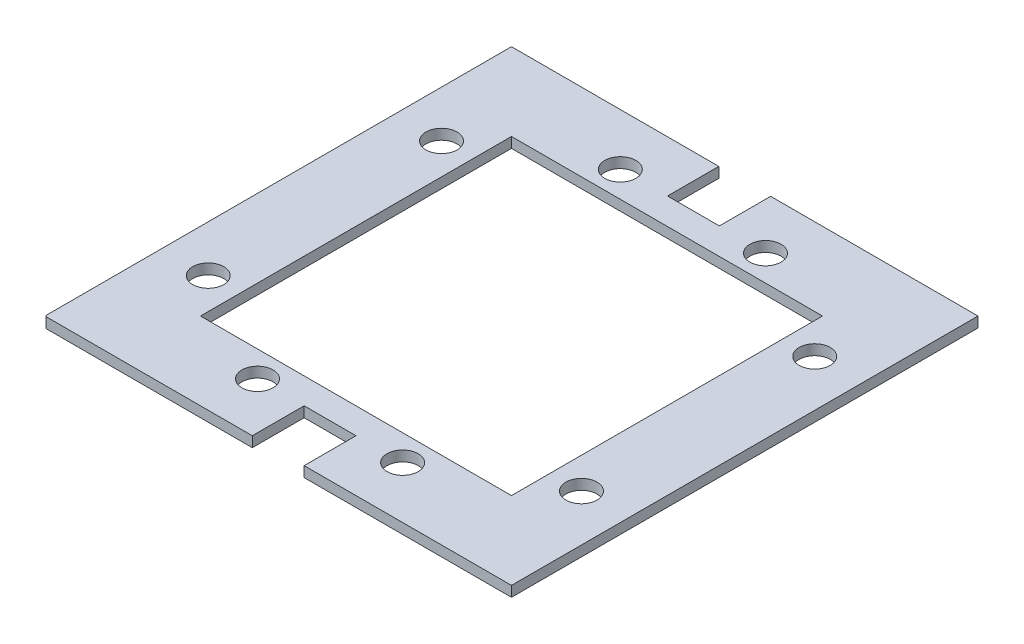
ISO-10303-21;
HEADER;
FILE_DESCRIPTION(('STEP AP214'),'2;1');
FILE_NAME('part.step','',(''),(''),'','','');
FILE_SCHEMA(('AUTOMOTIVE_DESIGN { 1 0 10303 214 1 1 1 1 }'));
ENDSEC;
DATA;
#1=APPLICATION_CONTEXT('core data for automotive mechanical design processes');
#2=APPLICATION_PROTOCOL_DEFINITION('international standard','automotive_design',2000,#1);
#3=PRODUCT_CONTEXT('',#1,'mechanical');
#4=PRODUCT('Part','Part','',(#3));
#5=PRODUCT_RELATED_PRODUCT_CATEGORY('part','',(#4));
#6=PRODUCT_DEFINITION_FORMATION('','',#4);
#7=PRODUCT_DEFINITION_CONTEXT('part definition',#1,'design');
#8=PRODUCT_DEFINITION('design','',#6,#7);
#9=PRODUCT_DEFINITION_SHAPE('','',#8);
#10=(LENGTH_UNIT() NAMED_UNIT(*) SI_UNIT(.MILLI.,.METRE.));
#11=(NAMED_UNIT(*) PLANE_ANGLE_UNIT() SI_UNIT($,.RADIAN.));
#12=(NAMED_UNIT(*) SI_UNIT($,.STERADIAN.) SOLID_ANGLE_UNIT());
#13=UNCERTAINTY_MEASURE_WITH_UNIT(LENGTH_MEASURE(1.E-05),#10,'distance_accuracy_value','');
#14=(GEOMETRIC_REPRESENTATION_CONTEXT(3) GLOBAL_UNCERTAINTY_ASSIGNED_CONTEXT((#13)) GLOBAL_UNIT_ASSIGNED_CONTEXT((#10,
#11,#12)) REPRESENTATION_CONTEXT('',''));
#15=CARTESIAN_POINT('',(0.,0.,0.));
#16=DIRECTION('',(0.,0.,1.));
#17=DIRECTION('',(1.,0.,0.));
#18=AXIS2_PLACEMENT_3D('',#15,#16,#17);
#19=CARTESIAN_POINT('',(0.,1.,7.5));
#20=DIRECTION('',(0.,0.,-1.));
#21=DIRECTION('',(-1.,0.,0.));
#22=AXIS2_PLACEMENT_3D('',#19,#20,#21);
#23=PLANE('',#22);
#24=DIRECTION('',(1.,0.,0.));
#25=VECTOR('',#24,1.);
#26=CARTESIAN_POINT('',(0.,0.,7.5));
#27=LINE('',#26,#25);
#28=CARTESIAN_POINT('',(-7.39845318230951,0.,7.5));
#29=VERTEX_POINT('',#28);
#30=CARTESIAN_POINT('',(12.5,0.,7.5));
#31=VERTEX_POINT('',#30);
#32=EDGE_CURVE('E284',#29,#31,#27,.T.);
#33=ORIENTED_EDGE('',*,*,#32,.T.);
#34=DIRECTION('',(0.,1.,0.));
#35=VECTOR('',#34,1.);
#36=CARTESIAN_POINT('',(12.5,-9.,7.5));
#37=LINE('',#36,#35);
#38=CARTESIAN_POINT('',(12.5,1.,7.5));
#39=VERTEX_POINT('',#38);
#40=EDGE_CURVE('E191',#31,#39,#37,.T.);
#41=ORIENTED_EDGE('',*,*,#40,.T.);
#42=DIRECTION('',(1.,0.,0.));
#43=VECTOR('',#42,1.);
#44=CARTESIAN_POINT('',(0.,1.,7.5));
#45=LINE('',#44,#43);
#46=CARTESIAN_POINT('',(-7.39845318230951,1.,7.5));
#47=VERTEX_POINT('',#46);
#48=EDGE_CURVE('E232',#47,#39,#45,.T.);
#49=ORIENTED_EDGE('',*,*,#48,.F.);
#50=DIRECTION('',(0.,-1.,0.));
#51=VECTOR('',#50,1.);
#52=CARTESIAN_POINT('',(-7.39845318230951,1.,7.5));
#53=LINE('',#52,#51);
#54=EDGE_CURVE('E311',#47,#29,#53,.T.);
#55=ORIENTED_EDGE('',*,*,#54,.T.);
#56=EDGE_LOOP('',(#33,#41,#49,#55));
#57=FACE_BOUND('',#56,.T.);
#58=ADVANCED_FACE('F34',(#57),#23,.F.);
#59=CARTESIAN_POINT('',(0.,1.,-37.5));
#60=DIRECTION('',(0.,0.,-1.));
#61=DIRECTION('',(-1.,0.,0.));
#62=AXIS2_PLACEMENT_3D('',#59,#60,#61);
#63=PLANE('',#62);
#64=DIRECTION('',(0.,1.,0.));
#65=VECTOR('',#64,1.);
#66=CARTESIAN_POINT('',(12.5,-9.,-37.5));
#67=LINE('',#66,#65);
#68=CARTESIAN_POINT('',(12.5,0.,-37.5));
#69=VERTEX_POINT('',#68);
#70=CARTESIAN_POINT('',(12.5,1.,-37.5));
#71=VERTEX_POINT('',#70);
#72=EDGE_CURVE('E166',#69,#71,#67,.T.);
#73=ORIENTED_EDGE('',*,*,#72,.F.);
#74=DIRECTION('',(1.,0.,0.));
#75=VECTOR('',#74,1.);
#76=CARTESIAN_POINT('',(0.,0.,-37.5));
#77=LINE('',#76,#75);
#78=CARTESIAN_POINT('',(-7.5,0.,-37.5));
#79=VERTEX_POINT('',#78);
#80=EDGE_CURVE('E291',#79,#69,#77,.T.);
#81=ORIENTED_EDGE('',*,*,#80,.F.);
#82=DIRECTION('',(0.,-1.,0.));
#83=VECTOR('',#82,1.);
#84=CARTESIAN_POINT('',(-7.5,1.,-37.5));
#85=LINE('',#84,#83);
#86=CARTESIAN_POINT('',(-7.5,1.,-37.5));
#87=VERTEX_POINT('',#86);
#88=EDGE_CURVE('E302',#87,#79,#85,.T.);
#89=ORIENTED_EDGE('',*,*,#88,.F.);
#90=DIRECTION('',(1.,0.,0.));
#91=VECTOR('',#90,1.);
#92=CARTESIAN_POINT('',(0.,1.,-37.5));
#93=LINE('',#92,#91);
#94=EDGE_CURVE('E239',#87,#71,#93,.T.);
#95=ORIENTED_EDGE('',*,*,#94,.T.);
#96=EDGE_LOOP('',(#73,#81,#89,#95));
#97=FACE_BOUND('',#96,.T.);
#98=ADVANCED_FACE('F371',(#97),#63,.T.);
#99=CARTESIAN_POINT('',(-7.5,1.,0.));
#100=DIRECTION('',(-1.,0.,0.));
#101=DIRECTION('',(0.,0.,1.));
#102=AXIS2_PLACEMENT_3D('',#99,#100,#101);
#103=PLANE('',#102);
#104=DIRECTION('',(0.,0.,-1.));
#105=VECTOR('',#104,1.);
#106=CARTESIAN_POINT('',(-7.5,0.,0.));
#107=LINE('',#106,#105);
#108=CARTESIAN_POINT('',(-7.5,0.,7.39845318230951));
#109=VERTEX_POINT('',#108);
#110=EDGE_CURVE('E277',#109,#79,#107,.T.);
#111=ORIENTED_EDGE('',*,*,#110,.F.);
#112=DIRECTION('',(0.,-1.,0.));
#113=VECTOR('',#112,1.);
#114=CARTESIAN_POINT('',(-7.5,1.,7.39845318230951));
#115=LINE('',#114,#113);
#116=CARTESIAN_POINT('',(-7.5,1.,7.39845318230951));
#117=VERTEX_POINT('',#116);
#118=EDGE_CURVE('E314',#117,#109,#115,.T.);
#119=ORIENTED_EDGE('',*,*,#118,.F.);
#120=DIRECTION('',(0.,0.,-1.));
#121=VECTOR('',#120,1.);
#122=CARTESIAN_POINT('',(-7.5,1.,0.));
#123=LINE('',#122,#121);
#124=EDGE_CURVE('E225',#117,#87,#123,.T.);
#125=ORIENTED_EDGE('',*,*,#124,.T.);
#126=ORIENTED_EDGE('',*,*,#88,.T.);
#127=EDGE_LOOP('',(#111,#119,#125,#126));
#128=FACE_BOUND('',#127,.T.);
#129=ADVANCED_FACE('F368',(#128),#103,.T.);
#130=CARTESIAN_POINT('',(-4.97487373415266,1.,4.97487373415274));
#131=DIRECTION('',(0.,-1.,0.));
#132=DIRECTION('',(0.,0.,-1.));
#133=AXIS2_PLACEMENT_3D('',#130,#131,#132);
#134=CYLINDRICAL_SURFACE('',#133,3.5);
#135=CARTESIAN_POINT('',(-4.97487373415266,0.,4.97487373415274));
#136=DIRECTION('',(0.,1.,0.));
#137=DIRECTION('',(0.,0.,1.));
#138=AXIS2_PLACEMENT_3D('',#135,#136,#137);
#139=CIRCLE('',#138,3.5);
#140=EDGE_CURVE('E280',#109,#29,#139,.T.);
#141=ORIENTED_EDGE('',*,*,#140,.T.);
#142=ORIENTED_EDGE('',*,*,#54,.F.);
#143=CARTESIAN_POINT('',(-4.97487373415266,1.,4.97487373415274));
#144=DIRECTION('',(0.,1.,0.));
#145=DIRECTION('',(0.,0.,1.));
#146=AXIS2_PLACEMENT_3D('',#143,#144,#145);
#147=CIRCLE('',#146,3.5);
#148=EDGE_CURVE('E228',#117,#47,#147,.T.);
#149=ORIENTED_EDGE('',*,*,#148,.F.);
#150=ORIENTED_EDGE('',*,*,#118,.T.);
#151=EDGE_LOOP('',(#141,#142,#149,#150));
#152=FACE_BOUND('',#151,.T.);
#153=ADVANCED_FACE('F364',(#152),#134,.T.);
#154=CARTESIAN_POINT('',(17.5,1.,7.5));
#155=VERTEX_POINT('',#154);
#156=CARTESIAN_POINT('',(37.5,1.,7.5));
#157=VERTEX_POINT('',#156);
#158=EDGE_CURVE('E231',#155,#157,#45,.T.);
#159=ORIENTED_EDGE('',*,*,#158,.F.);
#160=DIRECTION('',(0.,1.,0.));
#161=VECTOR('',#160,1.);
#162=CARTESIAN_POINT('',(17.5,-9.,7.5));
#163=LINE('',#162,#161);
#164=CARTESIAN_POINT('',(17.5,0.,7.5));
#165=VERTEX_POINT('',#164);
#166=EDGE_CURVE('E194',#165,#155,#163,.T.);
#167=ORIENTED_EDGE('',*,*,#166,.F.);
#168=CARTESIAN_POINT('',(37.5,0.,7.5));
#169=VERTEX_POINT('',#168);
#170=EDGE_CURVE('E283',#165,#169,#27,.T.);
#171=ORIENTED_EDGE('',*,*,#170,.T.);
#172=DIRECTION('',(0.,-1.,0.));
#173=VECTOR('',#172,1.);
#174=CARTESIAN_POINT('',(37.5,1.,7.5));
#175=LINE('',#174,#173);
#176=EDGE_CURVE('E308',#157,#169,#175,.T.);
#177=ORIENTED_EDGE('',*,*,#176,.F.);
#178=EDGE_LOOP('',(#159,#167,#171,#177));
#179=FACE_BOUND('',#178,.T.);
#180=ADVANCED_FACE('F350',(#179),#23,.F.);
#181=CARTESIAN_POINT('',(37.5,1.,0.));
#182=DIRECTION('',(-1.,0.,0.));
#183=DIRECTION('',(0.,0.,1.));
#184=AXIS2_PLACEMENT_3D('',#181,#182,#183);
#185=PLANE('',#184);
#186=DIRECTION('',(0.,0.,-1.));
#187=VECTOR('',#186,1.);
#188=CARTESIAN_POINT('',(37.5,0.,0.));
#189=LINE('',#188,#187);
#190=CARTESIAN_POINT('',(37.5,0.,-37.5));
#191=VERTEX_POINT('',#190);
#192=EDGE_CURVE('E287',#169,#191,#189,.T.);
#193=ORIENTED_EDGE('',*,*,#192,.T.);
#194=DIRECTION('',(0.,-1.,0.));
#195=VECTOR('',#194,1.);
#196=CARTESIAN_POINT('',(37.5,1.,-37.5));
#197=LINE('',#196,#195);
#198=CARTESIAN_POINT('',(37.5,1.,-37.5));
#199=VERTEX_POINT('',#198);
#200=EDGE_CURVE('E304',#199,#191,#197,.T.);
#201=ORIENTED_EDGE('',*,*,#200,.F.);
#202=DIRECTION('',(0.,0.,-1.));
#203=VECTOR('',#202,1.);
#204=CARTESIAN_POINT('',(37.5,1.,0.));
#205=LINE('',#204,#203);
#206=EDGE_CURVE('E235',#157,#199,#205,.T.);
#207=ORIENTED_EDGE('',*,*,#206,.F.);
#208=ORIENTED_EDGE('',*,*,#176,.T.);
#209=EDGE_LOOP('',(#193,#201,#207,#208));
#210=FACE_BOUND('',#209,.T.);
#211=ADVANCED_FACE('F344',(#210),#185,.F.);
#212=CARTESIAN_POINT('',(30.,1.,0.));
#213=DIRECTION('',(-1.,0.,0.));
#214=DIRECTION('',(0.,0.,1.));
#215=AXIS2_PLACEMENT_3D('',#212,#213,#214);
#216=PLANE('',#215);
#217=DIRECTION('',(0.,0.,-1.));
#218=VECTOR('',#217,1.);
#219=CARTESIAN_POINT('',(30.,0.,0.));
#220=LINE('',#219,#218);
#221=CARTESIAN_POINT('',(30.,0.,0.));
#222=VERTEX_POINT('',#221);
#223=CARTESIAN_POINT('',(30.,0.,-30.));
#224=VERTEX_POINT('',#223);
#225=EDGE_CURVE('E262',#222,#224,#220,.T.);
#226=ORIENTED_EDGE('',*,*,#225,.F.);
#227=DIRECTION('',(0.,-1.,0.));
#228=VECTOR('',#227,1.);
#229=CARTESIAN_POINT('',(30.,1.,0.));
#230=LINE('',#229,#228);
#231=CARTESIAN_POINT('',(30.,1.,0.));
#232=VERTEX_POINT('',#231);
#233=EDGE_CURVE('E305',#232,#222,#230,.T.);
#234=ORIENTED_EDGE('',*,*,#233,.F.);
#235=DIRECTION('',(0.,0.,-1.));
#236=VECTOR('',#235,1.);
#237=CARTESIAN_POINT('',(30.,1.,0.));
#238=LINE('',#237,#236);
#239=CARTESIAN_POINT('',(30.,1.,-30.));
#240=VERTEX_POINT('',#239);
#241=EDGE_CURVE('E211',#232,#240,#238,.T.);
#242=ORIENTED_EDGE('',*,*,#241,.T.);
#243=DIRECTION('',(0.,-1.,0.));
#244=VECTOR('',#243,1.);
#245=CARTESIAN_POINT('',(30.,1.,-30.));
#246=LINE('',#245,#244);
#247=EDGE_CURVE('E250',#240,#224,#246,.T.);
#248=ORIENTED_EDGE('',*,*,#247,.T.);
#249=EDGE_LOOP('',(#226,#234,#242,#248));
#250=FACE_BOUND('',#249,.T.);
#251=ADVANCED_FACE('F504',(#250),#216,.T.);
#252=CARTESIAN_POINT('',(0.,1.,0.));
#253=DIRECTION('',(0.,0.,-1.));
#254=DIRECTION('',(-1.,0.,0.));
#255=AXIS2_PLACEMENT_3D('',#252,#253,#254);
#256=PLANE('',#255);
#257=DIRECTION('',(1.,0.,0.));
#258=VECTOR('',#257,1.);
#259=CARTESIAN_POINT('',(0.,0.,0.));
#260=LINE('',#259,#258);
#261=CARTESIAN_POINT('',(0.,0.,0.));
#262=VERTEX_POINT('',#261);
#263=EDGE_CURVE('E265',#262,#222,#260,.T.);
#264=ORIENTED_EDGE('',*,*,#263,.F.);
#265=DIRECTION('',(0.,-1.,0.));
#266=VECTOR('',#265,1.);
#267=CARTESIAN_POINT('',(0.,1.,0.));
#268=LINE('',#267,#266);
#269=CARTESIAN_POINT('',(0.,1.,0.));
#270=VERTEX_POINT('',#269);
#271=EDGE_CURVE('E321',#270,#262,#268,.T.);
#272=ORIENTED_EDGE('',*,*,#271,.F.);
#273=DIRECTION('',(1.,0.,0.));
#274=VECTOR('',#273,1.);
#275=CARTESIAN_POINT('',(0.,1.,0.));
#276=LINE('',#275,#274);
#277=EDGE_CURVE('E214',#270,#232,#276,.T.);
#278=ORIENTED_EDGE('',*,*,#277,.T.);
#279=ORIENTED_EDGE('',*,*,#233,.T.);
#280=EDGE_LOOP('',(#264,#272,#278,#279));
#281=FACE_BOUND('',#280,.T.);
#282=ADVANCED_FACE('F509',(#281),#256,.T.);
#283=CARTESIAN_POINT('',(0.,1.,0.));
#284=DIRECTION('',(-1.,0.,0.));
#285=DIRECTION('',(0.,0.,1.));
#286=AXIS2_PLACEMENT_3D('',#283,#284,#285);
#287=PLANE('',#286);
#288=DIRECTION('',(0.,0.,-1.));
#289=VECTOR('',#288,1.);
#290=CARTESIAN_POINT('',(0.,0.,0.));
#291=LINE('',#290,#289);
#292=CARTESIAN_POINT('',(0.,0.,-30.));
#293=VERTEX_POINT('',#292);
#294=EDGE_CURVE('E268',#262,#293,#291,.T.);
#295=ORIENTED_EDGE('',*,*,#294,.T.);
#296=DIRECTION('',(0.,-1.,0.));
#297=VECTOR('',#296,1.);
#298=CARTESIAN_POINT('',(0.,1.,-30.));
#299=LINE('',#298,#297);
#300=CARTESIAN_POINT('',(0.,1.,-30.));
#301=VERTEX_POINT('',#300);
#302=EDGE_CURVE('E318',#301,#293,#299,.T.);
#303=ORIENTED_EDGE('',*,*,#302,.F.);
#304=DIRECTION('',(0.,0.,-1.));
#305=VECTOR('',#304,1.);
#306=CARTESIAN_POINT('',(0.,1.,0.));
#307=LINE('',#306,#305);
#308=EDGE_CURVE('E217',#270,#301,#307,.T.);
#309=ORIENTED_EDGE('',*,*,#308,.F.);
#310=ORIENTED_EDGE('',*,*,#271,.T.);
#311=EDGE_LOOP('',(#295,#303,#309,#310));
#312=FACE_BOUND('',#311,.T.);
#313=ADVANCED_FACE('F397',(#312),#287,.F.);
#314=CARTESIAN_POINT('',(33.,1.,-3.75000000000001));
#315=DIRECTION('',(0.,-1.,0.));
#316=DIRECTION('',(0.,0.,-1.));
#317=AXIS2_PLACEMENT_3D('',#314,#315,#316);
#318=CYLINDRICAL_SURFACE('',#317,1.5);
#319=CARTESIAN_POINT('',(33.,1.,-3.75000000000001));
#320=DIRECTION('',(0.,1.,0.));
#321=DIRECTION('',(0.,0.,1.));
#322=AXIS2_PLACEMENT_3D('',#319,#320,#321);
#323=CIRCLE('',#322,1.5);
#324=CARTESIAN_POINT('',(33.,1.,-2.25));
#325=VERTEX_POINT('',#324);
#326=EDGE_CURVE('E244',#325,#325,#323,.T.);
#327=ORIENTED_EDGE('',*,*,#326,.T.);
#328=EDGE_LOOP('',(#327));
#329=FACE_BOUND('',#328,.T.);
#330=CARTESIAN_POINT('',(33.,0.,-3.75000000000001));
#331=DIRECTION('',(0.,1.,0.));
#332=DIRECTION('',(0.,0.,1.));
#333=AXIS2_PLACEMENT_3D('',#330,#331,#332);
#334=CIRCLE('',#333,1.5);
#335=CARTESIAN_POINT('',(33.,0.,-2.25));
#336=VERTEX_POINT('',#335);
#337=EDGE_CURVE('E297',#336,#336,#334,.T.);
#338=ORIENTED_EDGE('',*,*,#337,.F.);
#339=EDGE_LOOP('',(#338));
#340=FACE_BOUND('',#339,.T.);
#341=ADVANCED_FACE('F392',(#329,#340),#318,.F.);
#342=CARTESIAN_POINT('',(33.,1.,-26.25));
#343=DIRECTION('',(0.,-1.,0.));
#344=DIRECTION('',(0.,0.,-1.));
#345=AXIS2_PLACEMENT_3D('',#342,#343,#344);
#346=CYLINDRICAL_SURFACE('',#345,1.5);
#347=CARTESIAN_POINT('',(33.,1.,-26.25));
#348=DIRECTION('',(0.,1.,0.));
#349=DIRECTION('',(0.,0.,1.));
#350=AXIS2_PLACEMENT_3D('',#347,#348,#349);
#351=CIRCLE('',#350,1.5);
#352=CARTESIAN_POINT('',(33.,1.,-24.75));
#353=VERTEX_POINT('',#352);
#354=EDGE_CURVE('E241',#353,#353,#351,.T.);
#355=ORIENTED_EDGE('',*,*,#354,.T.);
#356=EDGE_LOOP('',(#355));
#357=FACE_BOUND('',#356,.T.);
#358=CARTESIAN_POINT('',(33.,0.,-26.25));
#359=DIRECTION('',(0.,1.,0.));
#360=DIRECTION('',(0.,0.,1.));
#361=AXIS2_PLACEMENT_3D('',#358,#359,#360);
#362=CIRCLE('',#361,1.5);
#363=CARTESIAN_POINT('',(33.,0.,-24.75));
#364=VERTEX_POINT('',#363);
#365=EDGE_CURVE('E294',#364,#364,#362,.T.);
#366=ORIENTED_EDGE('',*,*,#365,.F.);
#367=EDGE_LOOP('',(#366));
#368=FACE_BOUND('',#367,.T.);
#369=ADVANCED_FACE('F384',(#357,#368),#346,.F.);
#370=DIRECTION('',(0.,1.,0.));
#371=VECTOR('',#370,1.);
#372=CARTESIAN_POINT('',(17.5,-9.,-37.5));
#373=LINE('',#372,#371);
#374=CARTESIAN_POINT('',(17.5,0.,-37.5));
#375=VERTEX_POINT('',#374);
#376=CARTESIAN_POINT('',(17.5,1.,-37.5));
#377=VERTEX_POINT('',#376);
#378=EDGE_CURVE('E180',#375,#377,#373,.T.);
#379=ORIENTED_EDGE('',*,*,#378,.T.);
#380=EDGE_CURVE('E238',#377,#199,#93,.T.);
#381=ORIENTED_EDGE('',*,*,#380,.T.);
#382=ORIENTED_EDGE('',*,*,#200,.T.);
#383=EDGE_CURVE('E290',#375,#191,#77,.T.);
#384=ORIENTED_EDGE('',*,*,#383,.F.);
#385=EDGE_LOOP('',(#379,#381,#382,#384));
#386=FACE_BOUND('',#385,.T.);
#387=ADVANCED_FACE('F340',(#386),#63,.T.);
#388=CARTESIAN_POINT('',(-3.,1.,-3.75000000000001));
#389=DIRECTION('',(0.,-1.,0.));
#390=DIRECTION('',(0.,0.,-1.));
#391=AXIS2_PLACEMENT_3D('',#388,#389,#390);
#392=CYLINDRICAL_SURFACE('',#391,1.5);
#393=CARTESIAN_POINT('',(-3.,1.,-3.75000000000001));
#394=DIRECTION('',(0.,1.,0.));
#395=DIRECTION('',(0.,0.,1.));
#396=AXIS2_PLACEMENT_3D('',#393,#394,#395);
#397=CIRCLE('',#396,1.5);
#398=CARTESIAN_POINT('',(-3.,1.,-2.25000000000001));
#399=VERTEX_POINT('',#398);
#400=EDGE_CURVE('E222',#399,#399,#397,.F.);
#401=ORIENTED_EDGE('',*,*,#400,.F.);
#402=EDGE_LOOP('',(#401));
#403=FACE_BOUND('',#402,.T.);
#404=CARTESIAN_POINT('',(-3.,0.,-3.75000000000001));
#405=DIRECTION('',(0.,1.,0.));
#406=DIRECTION('',(0.,0.,1.));
#407=AXIS2_PLACEMENT_3D('',#404,#405,#406);
#408=CIRCLE('',#407,1.5);
#409=CARTESIAN_POINT('',(-3.,0.,-2.25000000000001));
#410=VERTEX_POINT('',#409);
#411=EDGE_CURVE('E274',#410,#410,#408,.F.);
#412=ORIENTED_EDGE('',*,*,#411,.T.);
#413=EDGE_LOOP('',(#412));
#414=FACE_BOUND('',#413,.T.);
#415=ADVANCED_FACE('F383',(#403,#414),#392,.F.);
#416=CARTESIAN_POINT('',(0.,1.,-30.));
#417=DIRECTION('',(0.,0.,-1.));
#418=DIRECTION('',(-1.,0.,0.));
#419=AXIS2_PLACEMENT_3D('',#416,#417,#418);
#420=PLANE('',#419);
#421=DIRECTION('',(1.,0.,0.));
#422=VECTOR('',#421,1.);
#423=CARTESIAN_POINT('',(0.,0.,-30.));
#424=LINE('',#423,#422);
#425=EDGE_CURVE('E271',#293,#224,#424,.T.);
#426=ORIENTED_EDGE('',*,*,#425,.T.);
#427=ORIENTED_EDGE('',*,*,#247,.F.);
#428=DIRECTION('',(1.,0.,0.));
#429=VECTOR('',#428,1.);
#430=CARTESIAN_POINT('',(0.,1.,-30.));
#431=LINE('',#430,#429);
#432=EDGE_CURVE('E220',#301,#240,#431,.T.);
#433=ORIENTED_EDGE('',*,*,#432,.F.);
#434=ORIENTED_EDGE('',*,*,#302,.T.);
#435=EDGE_LOOP('',(#426,#427,#433,#434));
#436=FACE_BOUND('',#435,.T.);
#437=ADVANCED_FACE('F389',(#436),#420,.F.);
#438=CARTESIAN_POINT('',(-3.,1.,-26.25));
#439=DIRECTION('',(0.,-1.,0.));
#440=DIRECTION('',(0.,0.,-1.));
#441=AXIS2_PLACEMENT_3D('',#438,#439,#440);
#442=CYLINDRICAL_SURFACE('',#441,1.5);
#443=CARTESIAN_POINT('',(-3.,1.,-26.25));
#444=DIRECTION('',(0.,1.,0.));
#445=DIRECTION('',(0.,0.,1.));
#446=AXIS2_PLACEMENT_3D('',#443,#444,#445);
#447=CIRCLE('',#446,1.5);
#448=CARTESIAN_POINT('',(-3.,1.,-24.75));
#449=VERTEX_POINT('',#448);
#450=EDGE_CURVE('E208',#449,#449,#447,.F.);
#451=ORIENTED_EDGE('',*,*,#450,.F.);
#452=EDGE_LOOP('',(#451));
#453=FACE_BOUND('',#452,.T.);
#454=CARTESIAN_POINT('',(-3.,0.,-26.25));
#455=DIRECTION('',(0.,1.,0.));
#456=DIRECTION('',(0.,0.,1.));
#457=AXIS2_PLACEMENT_3D('',#454,#455,#456);
#458=CIRCLE('',#457,1.5);
#459=CARTESIAN_POINT('',(-3.,0.,-24.75));
#460=VERTEX_POINT('',#459);
#461=EDGE_CURVE('E259',#460,#460,#458,.F.);
#462=ORIENTED_EDGE('',*,*,#461,.T.);
#463=EDGE_LOOP('',(#462));
#464=FACE_BOUND('',#463,.T.);
#465=ADVANCED_FACE('F546',(#453,#464),#442,.F.);
#466=CARTESIAN_POINT('',(8.,1.,-32.5));
#467=DIRECTION('',(0.,-1.,0.));
#468=DIRECTION('',(0.,0.,-1.));
#469=AXIS2_PLACEMENT_3D('',#466,#467,#468);
#470=CYLINDRICAL_SURFACE('',#469,1.5);
#471=CARTESIAN_POINT('',(8.,1.,-32.5));
#472=DIRECTION('',(0.,1.,0.));
#473=DIRECTION('',(0.,0.,1.));
#474=AXIS2_PLACEMENT_3D('',#471,#472,#473);
#475=CIRCLE('',#474,1.5);
#476=CARTESIAN_POINT('',(8.,1.,-31.));
#477=VERTEX_POINT('',#476);
#478=EDGE_CURVE('E205',#477,#477,#475,.T.);
#479=ORIENTED_EDGE('',*,*,#478,.T.);
#480=EDGE_LOOP('',(#479));
#481=FACE_BOUND('',#480,.T.);
#482=CARTESIAN_POINT('',(8.,0.,-32.5));
#483=DIRECTION('',(0.,1.,0.));
#484=DIRECTION('',(0.,0.,1.));
#485=AXIS2_PLACEMENT_3D('',#482,#483,#484);
#486=CIRCLE('',#485,1.5);
#487=CARTESIAN_POINT('',(8.,0.,-31.));
#488=VERTEX_POINT('',#487);
#489=EDGE_CURVE('E256',#488,#488,#486,.T.);
#490=ORIENTED_EDGE('',*,*,#489,.F.);
#491=EDGE_LOOP('',(#490));
#492=FACE_BOUND('',#491,.T.);
#493=ADVANCED_FACE('F556',(#481,#492),#470,.F.);
#494=CARTESIAN_POINT('',(22.,1.,-32.5));
#495=DIRECTION('',(0.,-1.,0.));
#496=DIRECTION('',(0.,0.,-1.));
#497=AXIS2_PLACEMENT_3D('',#494,#495,#496);
#498=CYLINDRICAL_SURFACE('',#497,1.5);
#499=CARTESIAN_POINT('',(22.,1.,-32.5));
#500=DIRECTION('',(0.,1.,0.));
#501=DIRECTION('',(0.,0.,1.));
#502=AXIS2_PLACEMENT_3D('',#499,#500,#501);
#503=CIRCLE('',#502,1.5);
#504=CARTESIAN_POINT('',(22.,1.,-31.));
#505=VERTEX_POINT('',#504);
#506=EDGE_CURVE('E201',#505,#505,#503,.T.);
#507=ORIENTED_EDGE('',*,*,#506,.T.);
#508=EDGE_LOOP('',(#507));
#509=FACE_BOUND('',#508,.T.);
#510=CARTESIAN_POINT('',(22.,0.,-32.5));
#511=DIRECTION('',(0.,1.,0.));
#512=DIRECTION('',(0.,0.,1.));
#513=AXIS2_PLACEMENT_3D('',#510,#511,#512);
#514=CIRCLE('',#513,1.5);
#515=CARTESIAN_POINT('',(22.,0.,-31.));
#516=VERTEX_POINT('',#515);
#517=EDGE_CURVE('E253',#516,#516,#514,.T.);
#518=ORIENTED_EDGE('',*,*,#517,.F.);
#519=EDGE_LOOP('',(#518));
#520=FACE_BOUND('',#519,.T.);
#521=ADVANCED_FACE('F566',(#509,#520),#498,.F.);
#522=CARTESIAN_POINT('',(22.,1.,2.5));
#523=DIRECTION('',(0.,-1.,0.));
#524=DIRECTION('',(0.,0.,-1.));
#525=AXIS2_PLACEMENT_3D('',#522,#523,#524);
#526=CYLINDRICAL_SURFACE('',#525,1.5);
#527=CARTESIAN_POINT('',(22.,1.,2.5));
#528=DIRECTION('',(0.,1.,0.));
#529=DIRECTION('',(0.,0.,1.));
#530=AXIS2_PLACEMENT_3D('',#527,#528,#529);
#531=CIRCLE('',#530,1.5);
#532=CARTESIAN_POINT('',(22.,1.,4.));
#533=VERTEX_POINT('',#532);
#534=EDGE_CURVE('E198',#533,#533,#531,.F.);
#535=ORIENTED_EDGE('',*,*,#534,.F.);
#536=EDGE_LOOP('',(#535));
#537=FACE_BOUND('',#536,.T.);
#538=CARTESIAN_POINT('',(22.,0.,2.5));
#539=DIRECTION('',(0.,1.,0.));
#540=DIRECTION('',(0.,0.,1.));
#541=AXIS2_PLACEMENT_3D('',#538,#539,#540);
#542=CIRCLE('',#541,1.5);
#543=CARTESIAN_POINT('',(22.,0.,4.));
#544=VERTEX_POINT('',#543);
#545=EDGE_CURVE('E179',#544,#544,#542,.F.);
#546=ORIENTED_EDGE('',*,*,#545,.T.);
#547=EDGE_LOOP('',(#546));
#548=FACE_BOUND('',#547,.T.);
#549=ADVANCED_FACE('F36',(#537,#548),#526,.F.);
#550=CARTESIAN_POINT('',(8.,1.,2.5));
#551=DIRECTION('',(0.,-1.,0.));
#552=DIRECTION('',(0.,0.,-1.));
#553=AXIS2_PLACEMENT_3D('',#550,#551,#552);
#554=CYLINDRICAL_SURFACE('',#553,1.5);
#555=CARTESIAN_POINT('',(8.,1.,2.5));
#556=DIRECTION('',(0.,1.,0.));
#557=DIRECTION('',(0.,0.,1.));
#558=AXIS2_PLACEMENT_3D('',#555,#556,#557);
#559=CIRCLE('',#558,1.5);
#560=CARTESIAN_POINT('',(8.,1.,4.));
#561=VERTEX_POINT('',#560);
#562=EDGE_CURVE('E247',#561,#561,#559,.F.);
#563=ORIENTED_EDGE('',*,*,#562,.F.);
#564=EDGE_LOOP('',(#563));
#565=FACE_BOUND('',#564,.T.);
#566=CARTESIAN_POINT('',(8.,0.,2.5));
#567=DIRECTION('',(0.,1.,0.));
#568=DIRECTION('',(0.,0.,1.));
#569=AXIS2_PLACEMENT_3D('',#566,#567,#568);
#570=CIRCLE('',#569,1.5);
#571=CARTESIAN_POINT('',(8.,0.,4.));
#572=VERTEX_POINT('',#571);
#573=EDGE_CURVE('E202',#572,#572,#570,.F.);
#574=ORIENTED_EDGE('',*,*,#573,.T.);
#575=EDGE_LOOP('',(#574));
#576=FACE_BOUND('',#575,.T.);
#577=ADVANCED_FACE('F402',(#565,#576),#554,.F.);
#578=CARTESIAN_POINT('',(0.,1.,0.));
#579=DIRECTION('',(0.,1.,0.));
#580=DIRECTION('',(0.,0.,1.));
#581=AXIS2_PLACEMENT_3D('',#578,#579,#580);
#582=PLANE('',#581);
#583=DIRECTION('',(0.,0.,1.));
#584=VECTOR('',#583,1.);
#585=CARTESIAN_POINT('',(12.5,1.,-37.5));
#586=LINE('',#585,#584);
#587=CARTESIAN_POINT('',(12.5,1.,-32.5507734088453));
#588=VERTEX_POINT('',#587);
#589=EDGE_CURVE('E163',#71,#588,#586,.T.);
#590=ORIENTED_EDGE('',*,*,#589,.F.);
#591=ORIENTED_EDGE('',*,*,#94,.F.);
#592=ORIENTED_EDGE('',*,*,#124,.F.);
#593=ORIENTED_EDGE('',*,*,#148,.T.);
#594=ORIENTED_EDGE('',*,*,#48,.T.);
#595=DIRECTION('',(0.,0.,1.));
#596=VECTOR('',#595,1.);
#597=CARTESIAN_POINT('',(12.5,1.,7.5));
#598=LINE('',#597,#596);
#599=CARTESIAN_POINT('',(12.5,1.,2.50000000000001));
#600=VERTEX_POINT('',#599);
#601=EDGE_CURVE('E184',#600,#39,#598,.T.);
#602=ORIENTED_EDGE('',*,*,#601,.F.);
#603=DIRECTION('',(-1.,0.,0.));
#604=VECTOR('',#603,1.);
#605=CARTESIAN_POINT('',(12.5,1.,2.50000000000001));
#606=LINE('',#605,#604);
#607=CARTESIAN_POINT('',(17.5,1.,2.50000000000001));
#608=VERTEX_POINT('',#607);
#609=EDGE_CURVE('E188',#608,#600,#606,.T.);
#610=ORIENTED_EDGE('',*,*,#609,.F.);
#611=DIRECTION('',(0.,0.,-1.));
#612=VECTOR('',#611,1.);
#613=CARTESIAN_POINT('',(17.5,1.,7.5));
#614=LINE('',#613,#612);
#615=EDGE_CURVE('E186',#155,#608,#614,.T.);
#616=ORIENTED_EDGE('',*,*,#615,.F.);
#617=ORIENTED_EDGE('',*,*,#158,.T.);
#618=ORIENTED_EDGE('',*,*,#206,.T.);
#619=ORIENTED_EDGE('',*,*,#380,.F.);
#620=DIRECTION('',(0.,0.,-1.));
#621=VECTOR('',#620,1.);
#622=CARTESIAN_POINT('',(17.5,1.,-37.5));
#623=LINE('',#622,#621);
#624=CARTESIAN_POINT('',(17.5,1.,-32.5507734088453));
#625=VERTEX_POINT('',#624);
#626=EDGE_CURVE('E160',#625,#377,#623,.T.);
#627=ORIENTED_EDGE('',*,*,#626,.F.);
#628=DIRECTION('',(1.,0.,0.));
#629=VECTOR('',#628,1.);
#630=CARTESIAN_POINT('',(12.5,1.,-32.5507734088453));
#631=LINE('',#630,#629);
#632=EDGE_CURVE('E155',#588,#625,#631,.T.);
#633=ORIENTED_EDGE('',*,*,#632,.F.);
#634=EDGE_LOOP('',(#590,#591,#592,#593,#594,#602,#610,#616,#617,#618,#619,#627,#633));
#635=FACE_BOUND('',#634,.T.);
#636=ORIENTED_EDGE('',*,*,#534,.T.);
#637=EDGE_LOOP('',(#636));
#638=FACE_BOUND('',#637,.T.);
#639=ORIENTED_EDGE('',*,*,#506,.F.);
#640=EDGE_LOOP('',(#639));
#641=FACE_BOUND('',#640,.T.);
#642=ORIENTED_EDGE('',*,*,#478,.F.);
#643=EDGE_LOOP('',(#642));
#644=FACE_BOUND('',#643,.T.);
#645=ORIENTED_EDGE('',*,*,#450,.T.);
#646=EDGE_LOOP('',(#645));
#647=FACE_BOUND('',#646,.T.);
#648=ORIENTED_EDGE('',*,*,#241,.F.);
#649=ORIENTED_EDGE('',*,*,#277,.F.);
#650=ORIENTED_EDGE('',*,*,#308,.T.);
#651=ORIENTED_EDGE('',*,*,#432,.T.);
#652=EDGE_LOOP('',(#648,#649,#650,#651));
#653=FACE_BOUND('',#652,.T.);
#654=ORIENTED_EDGE('',*,*,#400,.T.);
#655=EDGE_LOOP('',(#654));
#656=FACE_BOUND('',#655,.T.);
#657=ORIENTED_EDGE('',*,*,#354,.F.);
#658=EDGE_LOOP('',(#657));
#659=FACE_BOUND('',#658,.T.);
#660=ORIENTED_EDGE('',*,*,#326,.F.);
#661=EDGE_LOOP('',(#660));
#662=FACE_BOUND('',#661,.T.);
#663=ORIENTED_EDGE('',*,*,#562,.T.);
#664=EDGE_LOOP('',(#663));
#665=FACE_BOUND('',#664,.T.);
#666=ADVANCED_FACE('F172',(#635,#638,#641,#644,#647,#653,#656,#659,#662,#665),#582,.T.);
#667=CARTESIAN_POINT('',(0.,0.,0.));
#668=DIRECTION('',(0.,1.,0.));
#669=DIRECTION('',(0.,0.,1.));
#670=AXIS2_PLACEMENT_3D('',#667,#668,#669);
#671=PLANE('',#670);
#672=ORIENTED_EDGE('',*,*,#80,.T.);
#673=DIRECTION('',(0.,0.,1.));
#674=VECTOR('',#673,1.);
#675=CARTESIAN_POINT('',(12.5,0.,0.));
#676=LINE('',#675,#674);
#677=CARTESIAN_POINT('',(12.5,0.,-32.5507734088453));
#678=VERTEX_POINT('',#677);
#679=EDGE_CURVE('E11',#69,#678,#676,.T.);
#680=ORIENTED_EDGE('',*,*,#679,.T.);
#681=DIRECTION('',(1.,0.,0.));
#682=VECTOR('',#681,1.);
#683=CARTESIAN_POINT('',(0.,0.,-32.5507734088453));
#684=LINE('',#683,#682);
#685=CARTESIAN_POINT('',(17.5,0.,-32.5507734088453));
#686=VERTEX_POINT('',#685);
#687=EDGE_CURVE('E158',#678,#686,#684,.T.);
#688=ORIENTED_EDGE('',*,*,#687,.T.);
#689=DIRECTION('',(0.,0.,-1.));
#690=VECTOR('',#689,1.);
#691=CARTESIAN_POINT('',(17.5,0.,0.));
#692=LINE('',#691,#690);
#693=EDGE_CURVE('E42',#686,#375,#692,.T.);
#694=ORIENTED_EDGE('',*,*,#693,.T.);
#695=ORIENTED_EDGE('',*,*,#383,.T.);
#696=ORIENTED_EDGE('',*,*,#192,.F.);
#697=ORIENTED_EDGE('',*,*,#170,.F.);
#698=DIRECTION('',(0.,0.,-1.));
#699=VECTOR('',#698,1.);
#700=CARTESIAN_POINT('',(17.5,0.,0.));
#701=LINE('',#700,#699);
#702=CARTESIAN_POINT('',(17.5,0.,2.50000000000001));
#703=VERTEX_POINT('',#702);
#704=EDGE_CURVE('E316',#165,#703,#701,.T.);
#705=ORIENTED_EDGE('',*,*,#704,.T.);
#706=DIRECTION('',(-1.,0.,0.));
#707=VECTOR('',#706,1.);
#708=CARTESIAN_POINT('',(0.,0.,2.50000000000001));
#709=LINE('',#708,#707);
#710=CARTESIAN_POINT('',(12.5,0.,2.50000000000001));
#711=VERTEX_POINT('',#710);
#712=EDGE_CURVE('E326',#703,#711,#709,.T.);
#713=ORIENTED_EDGE('',*,*,#712,.T.);
#714=DIRECTION('',(0.,0.,1.));
#715=VECTOR('',#714,1.);
#716=CARTESIAN_POINT('',(12.5,0.,0.));
#717=LINE('',#716,#715);
#718=EDGE_CURVE('E329',#711,#31,#717,.T.);
#719=ORIENTED_EDGE('',*,*,#718,.T.);
#720=ORIENTED_EDGE('',*,*,#32,.F.);
#721=ORIENTED_EDGE('',*,*,#140,.F.);
#722=ORIENTED_EDGE('',*,*,#110,.T.);
#723=EDGE_LOOP('',(#672,#680,#688,#694,#695,#696,#697,#705,#713,#719,#720,#721,#722));
#724=FACE_BOUND('',#723,.T.);
#725=ORIENTED_EDGE('',*,*,#545,.F.);
#726=EDGE_LOOP('',(#725));
#727=FACE_BOUND('',#726,.T.);
#728=ORIENTED_EDGE('',*,*,#517,.T.);
#729=EDGE_LOOP('',(#728));
#730=FACE_BOUND('',#729,.T.);
#731=ORIENTED_EDGE('',*,*,#489,.T.);
#732=EDGE_LOOP('',(#731));
#733=FACE_BOUND('',#732,.T.);
#734=ORIENTED_EDGE('',*,*,#461,.F.);
#735=EDGE_LOOP('',(#734));
#736=FACE_BOUND('',#735,.T.);
#737=ORIENTED_EDGE('',*,*,#225,.T.);
#738=ORIENTED_EDGE('',*,*,#425,.F.);
#739=ORIENTED_EDGE('',*,*,#294,.F.);
#740=ORIENTED_EDGE('',*,*,#263,.T.);
#741=EDGE_LOOP('',(#737,#738,#739,#740));
#742=FACE_BOUND('',#741,.T.);
#743=ORIENTED_EDGE('',*,*,#411,.F.);
#744=EDGE_LOOP('',(#743));
#745=FACE_BOUND('',#744,.T.);
#746=ORIENTED_EDGE('',*,*,#365,.T.);
#747=EDGE_LOOP('',(#746));
#748=FACE_BOUND('',#747,.T.);
#749=ORIENTED_EDGE('',*,*,#337,.T.);
#750=EDGE_LOOP('',(#749));
#751=FACE_BOUND('',#750,.T.);
#752=ORIENTED_EDGE('',*,*,#573,.F.);
#753=EDGE_LOOP('',(#752));
#754=FACE_BOUND('',#753,.T.);
#755=ADVANCED_FACE('F335',(#724,#727,#730,#733,#736,#742,#745,#748,#751,#754),#671,.F.);
#756=CARTESIAN_POINT('',(12.5,-9.,7.5));
#757=DIRECTION('',(-1.,0.,0.));
#758=DIRECTION('',(0.,0.,1.));
#759=AXIS2_PLACEMENT_3D('',#756,#757,#758);
#760=PLANE('',#759);
#761=DIRECTION('',(0.,1.,0.));
#762=VECTOR('',#761,1.);
#763=CARTESIAN_POINT('',(12.5,-9.,2.50000000000001));
#764=LINE('',#763,#762);
#765=EDGE_CURVE('E170',#711,#600,#764,.T.);
#766=ORIENTED_EDGE('',*,*,#765,.T.);
#767=ORIENTED_EDGE('',*,*,#601,.T.);
#768=ORIENTED_EDGE('',*,*,#40,.F.);
#769=ORIENTED_EDGE('',*,*,#718,.F.);
#770=EDGE_LOOP('',(#766,#767,#768,#769));
#771=FACE_BOUND('',#770,.T.);
#772=ADVANCED_FACE('F408',(#771),#760,.F.);
#773=CARTESIAN_POINT('',(12.5,-9.,2.50000000000001));
#774=DIRECTION('',(0.,0.,-1.));
#775=DIRECTION('',(-1.,0.,0.));
#776=AXIS2_PLACEMENT_3D('',#773,#774,#775);
#777=PLANE('',#776);
#778=DIRECTION('',(0.,1.,0.));
#779=VECTOR('',#778,1.);
#780=CARTESIAN_POINT('',(17.5,-9.,2.50000000000001));
#781=LINE('',#780,#779);
#782=EDGE_CURVE('E57',#703,#608,#781,.T.);
#783=ORIENTED_EDGE('',*,*,#782,.T.);
#784=ORIENTED_EDGE('',*,*,#609,.T.);
#785=ORIENTED_EDGE('',*,*,#765,.F.);
#786=ORIENTED_EDGE('',*,*,#712,.F.);
#787=EDGE_LOOP('',(#783,#784,#785,#786));
#788=FACE_BOUND('',#787,.T.);
#789=ADVANCED_FACE('F357',(#788),#777,.F.);
#790=CARTESIAN_POINT('',(17.5,-9.,7.5));
#791=DIRECTION('',(1.,0.,0.));
#792=DIRECTION('',(0.,0.,-1.));
#793=AXIS2_PLACEMENT_3D('',#790,#791,#792);
#794=PLANE('',#793);
#795=ORIENTED_EDGE('',*,*,#166,.T.);
#796=ORIENTED_EDGE('',*,*,#615,.T.);
#797=ORIENTED_EDGE('',*,*,#782,.F.);
#798=ORIENTED_EDGE('',*,*,#704,.F.);
#799=EDGE_LOOP('',(#795,#796,#797,#798));
#800=FACE_BOUND('',#799,.T.);
#801=ADVANCED_FACE('F352',(#800),#794,.F.);
#802=CARTESIAN_POINT('',(12.5,-9.,-37.5));
#803=DIRECTION('',(-1.,0.,0.));
#804=DIRECTION('',(0.,0.,1.));
#805=AXIS2_PLACEMENT_3D('',#802,#803,#804);
#806=PLANE('',#805);
#807=ORIENTED_EDGE('',*,*,#72,.T.);
#808=ORIENTED_EDGE('',*,*,#589,.T.);
#809=DIRECTION('',(0.,1.,0.));
#810=VECTOR('',#809,1.);
#811=CARTESIAN_POINT('',(12.5,-9.,-32.5507734088453));
#812=LINE('',#811,#810);
#813=EDGE_CURVE('E151',#678,#588,#812,.T.);
#814=ORIENTED_EDGE('',*,*,#813,.F.);
#815=ORIENTED_EDGE('',*,*,#679,.F.);
#816=EDGE_LOOP('',(#807,#808,#814,#815));
#817=FACE_BOUND('',#816,.T.);
#818=ADVANCED_FACE('F164',(#817),#806,.F.);
#819=CARTESIAN_POINT('',(17.5,-9.,-37.5));
#820=DIRECTION('',(1.,0.,0.));
#821=DIRECTION('',(0.,0.,-1.));
#822=AXIS2_PLACEMENT_3D('',#819,#820,#821);
#823=PLANE('',#822);
#824=DIRECTION('',(0.,1.,0.));
#825=VECTOR('',#824,1.);
#826=CARTESIAN_POINT('',(17.5,-9.,-32.5507734088453));
#827=LINE('',#826,#825);
#828=EDGE_CURVE('E49',#686,#625,#827,.T.);
#829=ORIENTED_EDGE('',*,*,#828,.T.);
#830=ORIENTED_EDGE('',*,*,#626,.T.);
#831=ORIENTED_EDGE('',*,*,#378,.F.);
#832=ORIENTED_EDGE('',*,*,#693,.F.);
#833=EDGE_LOOP('',(#829,#830,#831,#832));
#834=FACE_BOUND('',#833,.T.);
#835=ADVANCED_FACE('F419',(#834),#823,.F.);
#836=CARTESIAN_POINT('',(12.5,-9.,-32.5507734088453));
#837=DIRECTION('',(0.,0.,1.));
#838=DIRECTION('',(1.,0.,0.));
#839=AXIS2_PLACEMENT_3D('',#836,#837,#838);
#840=PLANE('',#839);
#841=ORIENTED_EDGE('',*,*,#813,.T.);
#842=ORIENTED_EDGE('',*,*,#632,.T.);
#843=ORIENTED_EDGE('',*,*,#828,.F.);
#844=ORIENTED_EDGE('',*,*,#687,.F.);
#845=EDGE_LOOP('',(#841,#842,#843,#844));
#846=FACE_BOUND('',#845,.T.);
#847=ADVANCED_FACE('F153',(#846),#840,.F.);
#848=CLOSED_SHELL('',(#58,#98,#129,#153,#180,#211,#251,#282,#313,#341,#369,#387,#415,#437,#465,
#493,#521,#549,#577,#666,#755,#772,#789,#801,#818,#835,#847));
#849=MANIFOLD_SOLID_BREP('B2',#848);
#850=ADVANCED_BREP_SHAPE_REPRESENTATION('',(#18,#849),#14);
#851=SHAPE_DEFINITION_REPRESENTATION(#9,#850);
ENDSEC;
END-ISO-10303-21;
